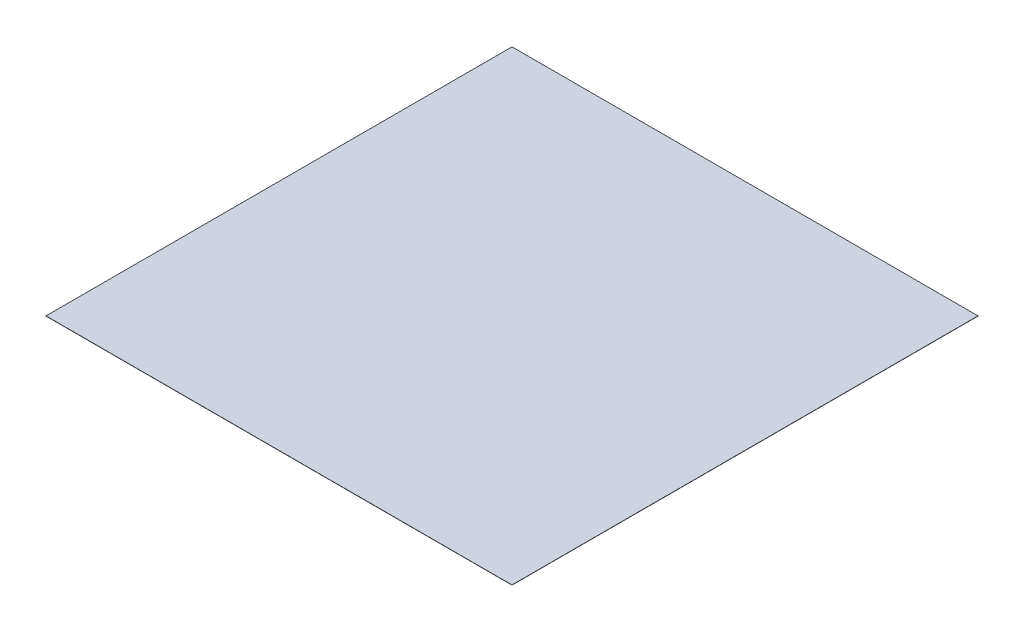
ISO-10303-21;
HEADER;
FILE_DESCRIPTION(('STEP AP214'),'2;1');
FILE_NAME('part.step','',(''),(''),'','','');
FILE_SCHEMA(('AUTOMOTIVE_DESIGN { 1 0 10303 214 1 1 1 1 }'));
ENDSEC;
DATA;
#1=APPLICATION_CONTEXT('core data for automotive mechanical design processes');
#2=APPLICATION_PROTOCOL_DEFINITION('international standard','automotive_design',2000,#1);
#3=PRODUCT_CONTEXT('',#1,'mechanical');
#4=PRODUCT('Part','Part','',(#3));
#5=PRODUCT_RELATED_PRODUCT_CATEGORY('part','',(#4));
#6=PRODUCT_DEFINITION_FORMATION('','',#4);
#7=PRODUCT_DEFINITION_CONTEXT('part definition',#1,'design');
#8=PRODUCT_DEFINITION('design','',#6,#7);
#9=PRODUCT_DEFINITION_SHAPE('','',#8);
#10=(LENGTH_UNIT() NAMED_UNIT(*) SI_UNIT(.MILLI.,.METRE.));
#11=(NAMED_UNIT(*) PLANE_ANGLE_UNIT() SI_UNIT($,.RADIAN.));
#12=(NAMED_UNIT(*) SI_UNIT($,.STERADIAN.) SOLID_ANGLE_UNIT());
#13=UNCERTAINTY_MEASURE_WITH_UNIT(LENGTH_MEASURE(1.E-05),#10,'distance_accuracy_value','');
#14=(GEOMETRIC_REPRESENTATION_CONTEXT(3) GLOBAL_UNCERTAINTY_ASSIGNED_CONTEXT((#13)) GLOBAL_UNIT_ASSIGNED_CONTEXT((#10,
#11,#12)) REPRESENTATION_CONTEXT('',''));
#15=CARTESIAN_POINT('',(0.,0.,0.));
#16=DIRECTION('',(0.,0.,1.));
#17=DIRECTION('',(1.,0.,0.));
#18=AXIS2_PLACEMENT_3D('',#15,#16,#17);
#19=CARTESIAN_POINT('',(0.,0.1,0.));
#20=DIRECTION('',(0.,-1.,0.));
#21=DIRECTION('',(0.,0.,-1.));
#22=AXIS2_PLACEMENT_3D('',#19,#20,#21);
#23=PLANE('',#22);
#24=DIRECTION('',(0.,0.,1.));
#25=VECTOR('',#24,1.);
#26=CARTESIAN_POINT('',(0.,0.1,0.));
#27=LINE('',#26,#25);
#28=CARTESIAN_POINT('',(0.,0.1,-210.));
#29=VERTEX_POINT('',#28);
#30=CARTESIAN_POINT('',(0.,0.1,0.));
#31=VERTEX_POINT('',#30);
#32=EDGE_CURVE('E135',#29,#31,#27,.T.);
#33=ORIENTED_EDGE('',*,*,#32,.T.);
#34=DIRECTION('',(1.,0.,0.));
#35=VECTOR('',#34,1.);
#36=CARTESIAN_POINT('',(0.,0.1,0.));
#37=LINE('',#36,#35);
#38=CARTESIAN_POINT('',(210.,0.1,0.));
#39=VERTEX_POINT('',#38);
#40=EDGE_CURVE('E138',#31,#39,#37,.T.);
#41=ORIENTED_EDGE('',*,*,#40,.T.);
#42=DIRECTION('',(0.,0.,-1.));
#43=VECTOR('',#42,1.);
#44=CARTESIAN_POINT('',(210.,0.1,0.));
#45=LINE('',#44,#43);
#46=CARTESIAN_POINT('',(210.,0.1,-210.));
#47=VERTEX_POINT('',#46);
#48=EDGE_CURVE('E141',#39,#47,#45,.T.);
#49=ORIENTED_EDGE('',*,*,#48,.T.);
#50=DIRECTION('',(-1.,0.,0.));
#51=VECTOR('',#50,1.);
#52=CARTESIAN_POINT('',(0.,0.1,-210.));
#53=LINE('',#52,#51);
#54=EDGE_CURVE('E143',#47,#29,#53,.T.);
#55=ORIENTED_EDGE('',*,*,#54,.T.);
#56=EDGE_LOOP('',(#33,#41,#49,#55));
#57=FACE_BOUND('',#56,.T.);
#58=DIRECTION('',(0.,0.,1.));
#59=VECTOR('',#58,1.);
#60=CARTESIAN_POINT('',(104.99,0.1,-104.99));
#61=LINE('',#60,#59);
#62=CARTESIAN_POINT('',(104.99,0.1,-105.01));
#63=VERTEX_POINT('',#62);
#64=CARTESIAN_POINT('',(104.99,0.1,-104.99));
#65=VERTEX_POINT('',#64);
#66=EDGE_CURVE('E99',#63,#65,#61,.T.);
#67=ORIENTED_EDGE('',*,*,#66,.F.);
#68=DIRECTION('',(-1.,0.,0.));
#69=VECTOR('',#68,1.);
#70=CARTESIAN_POINT('',(104.99,0.1,-105.01));
#71=LINE('',#70,#69);
#72=CARTESIAN_POINT('',(105.01,0.1,-105.01));
#73=VERTEX_POINT('',#72);
#74=EDGE_CURVE('E121',#73,#63,#71,.T.);
#75=ORIENTED_EDGE('',*,*,#74,.F.);
#76=DIRECTION('',(0.,0.,-1.));
#77=VECTOR('',#76,1.);
#78=CARTESIAN_POINT('',(105.01,0.1,-104.99));
#79=LINE('',#78,#77);
#80=CARTESIAN_POINT('',(105.01,0.1,-104.99));
#81=VERTEX_POINT('',#80);
#82=EDGE_CURVE('E119',#81,#73,#79,.T.);
#83=ORIENTED_EDGE('',*,*,#82,.F.);
#84=DIRECTION('',(1.,0.,0.));
#85=VECTOR('',#84,1.);
#86=CARTESIAN_POINT('',(104.99,0.1,-104.99));
#87=LINE('',#86,#85);
#88=EDGE_CURVE('E107',#65,#81,#87,.T.);
#89=ORIENTED_EDGE('',*,*,#88,.F.);
#90=EDGE_LOOP('',(#67,#75,#83,#89));
#91=FACE_BOUND('',#90,.T.);
#92=ADVANCED_FACE('F34',(#57,#91),#23,.F.);
#93=CARTESIAN_POINT('',(0.,0.,0.));
#94=DIRECTION('',(0.,-1.,0.));
#95=DIRECTION('',(0.,0.,-1.));
#96=AXIS2_PLACEMENT_3D('',#93,#94,#95);
#97=PLANE('',#96);
#98=DIRECTION('',(0.,0.,1.));
#99=VECTOR('',#98,1.);
#100=CARTESIAN_POINT('',(0.,0.,0.));
#101=LINE('',#100,#99);
#102=CARTESIAN_POINT('',(0.,0.,-210.));
#103=VERTEX_POINT('',#102);
#104=CARTESIAN_POINT('',(0.,0.,0.));
#105=VERTEX_POINT('',#104);
#106=EDGE_CURVE('E115',#103,#105,#101,.T.);
#107=ORIENTED_EDGE('',*,*,#106,.F.);
#108=DIRECTION('',(-1.,0.,0.));
#109=VECTOR('',#108,1.);
#110=CARTESIAN_POINT('',(0.,0.,-210.));
#111=LINE('',#110,#109);
#112=CARTESIAN_POINT('',(210.,0.,-210.));
#113=VERTEX_POINT('',#112);
#114=EDGE_CURVE('E139',#113,#103,#111,.T.);
#115=ORIENTED_EDGE('',*,*,#114,.F.);
#116=DIRECTION('',(0.,0.,-1.));
#117=VECTOR('',#116,1.);
#118=CARTESIAN_POINT('',(210.,0.,0.));
#119=LINE('',#118,#117);
#120=CARTESIAN_POINT('',(210.,0.,0.));
#121=VERTEX_POINT('',#120);
#122=EDGE_CURVE('E150',#121,#113,#119,.T.);
#123=ORIENTED_EDGE('',*,*,#122,.F.);
#124=DIRECTION('',(1.,0.,0.));
#125=VECTOR('',#124,1.);
#126=CARTESIAN_POINT('',(0.,0.,0.));
#127=LINE('',#126,#125);
#128=EDGE_CURVE('E148',#105,#121,#127,.T.);
#129=ORIENTED_EDGE('',*,*,#128,.F.);
#130=EDGE_LOOP('',(#107,#115,#123,#129));
#131=FACE_BOUND('',#130,.T.);
#132=DIRECTION('',(-1.,0.,0.));
#133=VECTOR('',#132,1.);
#134=CARTESIAN_POINT('',(104.99,0.,-105.01));
#135=LINE('',#134,#133);
#136=CARTESIAN_POINT('',(105.01,0.,-105.01));
#137=VERTEX_POINT('',#136);
#138=CARTESIAN_POINT('',(104.99,0.,-105.01));
#139=VERTEX_POINT('',#138);
#140=EDGE_CURVE('E108',#137,#139,#135,.T.);
#141=ORIENTED_EDGE('',*,*,#140,.T.);
#142=DIRECTION('',(0.,0.,1.));
#143=VECTOR('',#142,1.);
#144=CARTESIAN_POINT('',(104.99,0.,-104.99));
#145=LINE('',#144,#143);
#146=CARTESIAN_POINT('',(104.99,0.,-104.99));
#147=VERTEX_POINT('',#146);
#148=EDGE_CURVE('E57',#139,#147,#145,.T.);
#149=ORIENTED_EDGE('',*,*,#148,.T.);
#150=DIRECTION('',(1.,0.,0.));
#151=VECTOR('',#150,1.);
#152=CARTESIAN_POINT('',(104.99,0.,-104.99));
#153=LINE('',#152,#151);
#154=CARTESIAN_POINT('',(105.01,0.,-104.99));
#155=VERTEX_POINT('',#154);
#156=EDGE_CURVE('E114',#147,#155,#153,.T.);
#157=ORIENTED_EDGE('',*,*,#156,.T.);
#158=DIRECTION('',(0.,0.,-1.));
#159=VECTOR('',#158,1.);
#160=CARTESIAN_POINT('',(105.01,0.,-104.99));
#161=LINE('',#160,#159);
#162=EDGE_CURVE('E127',#155,#137,#161,.T.);
#163=ORIENTED_EDGE('',*,*,#162,.T.);
#164=EDGE_LOOP('',(#141,#149,#157,#163));
#165=FACE_BOUND('',#164,.T.);
#166=ADVANCED_FACE('F168',(#131,#165),#97,.T.);
#167=CARTESIAN_POINT('',(0.,0.1,0.));
#168=DIRECTION('',(1.,0.,0.));
#169=DIRECTION('',(0.,0.,-1.));
#170=AXIS2_PLACEMENT_3D('',#167,#168,#169);
#171=PLANE('',#170);
#172=ORIENTED_EDGE('',*,*,#106,.T.);
#173=DIRECTION('',(0.,-1.,0.));
#174=VECTOR('',#173,1.);
#175=CARTESIAN_POINT('',(0.,0.1,0.));
#176=LINE('',#175,#174);
#177=EDGE_CURVE('E11',#31,#105,#176,.T.);
#178=ORIENTED_EDGE('',*,*,#177,.F.);
#179=ORIENTED_EDGE('',*,*,#32,.F.);
#180=DIRECTION('',(0.,-1.,0.));
#181=VECTOR('',#180,1.);
#182=CARTESIAN_POINT('',(0.,0.1,-210.));
#183=LINE('',#182,#181);
#184=EDGE_CURVE('E145',#29,#103,#183,.T.);
#185=ORIENTED_EDGE('',*,*,#184,.T.);
#186=EDGE_LOOP('',(#172,#178,#179,#185));
#187=FACE_BOUND('',#186,.T.);
#188=ADVANCED_FACE('F36',(#187),#171,.F.);
#189=CARTESIAN_POINT('',(0.,0.1,0.));
#190=DIRECTION('',(0.,0.,-1.));
#191=DIRECTION('',(-1.,0.,0.));
#192=AXIS2_PLACEMENT_3D('',#189,#190,#191);
#193=PLANE('',#192);
#194=ORIENTED_EDGE('',*,*,#128,.T.);
#195=DIRECTION('',(0.,-1.,0.));
#196=VECTOR('',#195,1.);
#197=CARTESIAN_POINT('',(210.,0.1,0.));
#198=LINE('',#197,#196);
#199=EDGE_CURVE('E42',#39,#121,#198,.T.);
#200=ORIENTED_EDGE('',*,*,#199,.F.);
#201=ORIENTED_EDGE('',*,*,#40,.F.);
#202=ORIENTED_EDGE('',*,*,#177,.T.);
#203=EDGE_LOOP('',(#194,#200,#201,#202));
#204=FACE_BOUND('',#203,.T.);
#205=ADVANCED_FACE('F178',(#204),#193,.F.);
#206=CARTESIAN_POINT('',(210.,0.1,0.));
#207=DIRECTION('',(-1.,0.,0.));
#208=DIRECTION('',(0.,0.,1.));
#209=AXIS2_PLACEMENT_3D('',#206,#207,#208);
#210=PLANE('',#209);
#211=ORIENTED_EDGE('',*,*,#122,.T.);
#212=DIRECTION('',(0.,-1.,0.));
#213=VECTOR('',#212,1.);
#214=CARTESIAN_POINT('',(210.,0.1,-210.));
#215=LINE('',#214,#213);
#216=EDGE_CURVE('E155',#47,#113,#215,.T.);
#217=ORIENTED_EDGE('',*,*,#216,.F.);
#218=ORIENTED_EDGE('',*,*,#48,.F.);
#219=ORIENTED_EDGE('',*,*,#199,.T.);
#220=EDGE_LOOP('',(#211,#217,#218,#219));
#221=FACE_BOUND('',#220,.T.);
#222=ADVANCED_FACE('F162',(#221),#210,.F.);
#223=CARTESIAN_POINT('',(0.,0.1,-210.));
#224=DIRECTION('',(0.,0.,1.));
#225=DIRECTION('',(1.,0.,0.));
#226=AXIS2_PLACEMENT_3D('',#223,#224,#225);
#227=PLANE('',#226);
#228=ORIENTED_EDGE('',*,*,#114,.T.);
#229=ORIENTED_EDGE('',*,*,#184,.F.);
#230=ORIENTED_EDGE('',*,*,#54,.F.);
#231=ORIENTED_EDGE('',*,*,#216,.T.);
#232=EDGE_LOOP('',(#228,#229,#230,#231));
#233=FACE_BOUND('',#232,.T.);
#234=ADVANCED_FACE('F172',(#233),#227,.F.);
#235=CARTESIAN_POINT('',(104.99,0.1,-104.99));
#236=DIRECTION('',(1.,0.,0.));
#237=DIRECTION('',(0.,0.,-1.));
#238=AXIS2_PLACEMENT_3D('',#235,#236,#237);
#239=PLANE('',#238);
#240=ORIENTED_EDGE('',*,*,#148,.F.);
#241=DIRECTION('',(0.,-1.,0.));
#242=VECTOR('',#241,1.);
#243=CARTESIAN_POINT('',(104.99,0.1,-105.01));
#244=LINE('',#243,#242);
#245=EDGE_CURVE('E103',#63,#139,#244,.T.);
#246=ORIENTED_EDGE('',*,*,#245,.F.);
#247=ORIENTED_EDGE('',*,*,#66,.T.);
#248=DIRECTION('',(0.,-1.,0.));
#249=VECTOR('',#248,1.);
#250=CARTESIAN_POINT('',(104.99,0.1,-104.99));
#251=LINE('',#250,#249);
#252=EDGE_CURVE('E102',#65,#147,#251,.T.);
#253=ORIENTED_EDGE('',*,*,#252,.T.);
#254=EDGE_LOOP('',(#240,#246,#247,#253));
#255=FACE_BOUND('',#254,.T.);
#256=ADVANCED_FACE('F101',(#255),#239,.T.);
#257=CARTESIAN_POINT('',(104.99,0.1,-104.99));
#258=DIRECTION('',(0.,0.,-1.));
#259=DIRECTION('',(-1.,0.,0.));
#260=AXIS2_PLACEMENT_3D('',#257,#258,#259);
#261=PLANE('',#260);
#262=ORIENTED_EDGE('',*,*,#156,.F.);
#263=ORIENTED_EDGE('',*,*,#252,.F.);
#264=ORIENTED_EDGE('',*,*,#88,.T.);
#265=DIRECTION('',(0.,-1.,0.));
#266=VECTOR('',#265,1.);
#267=CARTESIAN_POINT('',(105.01,0.1,-104.99));
#268=LINE('',#267,#266);
#269=EDGE_CURVE('E116',#81,#155,#268,.T.);
#270=ORIENTED_EDGE('',*,*,#269,.T.);
#271=EDGE_LOOP('',(#262,#263,#264,#270));
#272=FACE_BOUND('',#271,.T.);
#273=ADVANCED_FACE('F111',(#272),#261,.T.);
#274=CARTESIAN_POINT('',(105.01,0.1,-104.99));
#275=DIRECTION('',(-1.,0.,0.));
#276=DIRECTION('',(0.,0.,1.));
#277=AXIS2_PLACEMENT_3D('',#274,#275,#276);
#278=PLANE('',#277);
#279=ORIENTED_EDGE('',*,*,#162,.F.);
#280=ORIENTED_EDGE('',*,*,#269,.F.);
#281=ORIENTED_EDGE('',*,*,#82,.T.);
#282=DIRECTION('',(0.,-1.,0.));
#283=VECTOR('',#282,1.);
#284=CARTESIAN_POINT('',(105.01,0.1,-105.01));
#285=LINE('',#284,#283);
#286=EDGE_CURVE('E49',#73,#137,#285,.T.);
#287=ORIENTED_EDGE('',*,*,#286,.T.);
#288=EDGE_LOOP('',(#279,#280,#281,#287));
#289=FACE_BOUND('',#288,.T.);
#290=ADVANCED_FACE('F201',(#289),#278,.T.);
#291=CARTESIAN_POINT('',(104.99,0.1,-105.01));
#292=DIRECTION('',(0.,0.,1.));
#293=DIRECTION('',(1.,0.,0.));
#294=AXIS2_PLACEMENT_3D('',#291,#292,#293);
#295=PLANE('',#294);
#296=ORIENTED_EDGE('',*,*,#140,.F.);
#297=ORIENTED_EDGE('',*,*,#286,.F.);
#298=ORIENTED_EDGE('',*,*,#74,.T.);
#299=ORIENTED_EDGE('',*,*,#245,.T.);
#300=EDGE_LOOP('',(#296,#297,#298,#299));
#301=FACE_BOUND('',#300,.T.);
#302=ADVANCED_FACE('F205',(#301),#295,.T.);
#303=CLOSED_SHELL('',(#92,#166,#188,#205,#222,#234,#256,#273,#290,#302));
#304=MANIFOLD_SOLID_BREP('B2',#303);
#305=ADVANCED_BREP_SHAPE_REPRESENTATION('',(#18,#304),#14);
#306=SHAPE_DEFINITION_REPRESENTATION(#9,#305);
ENDSEC;
END-ISO-10303-21;
